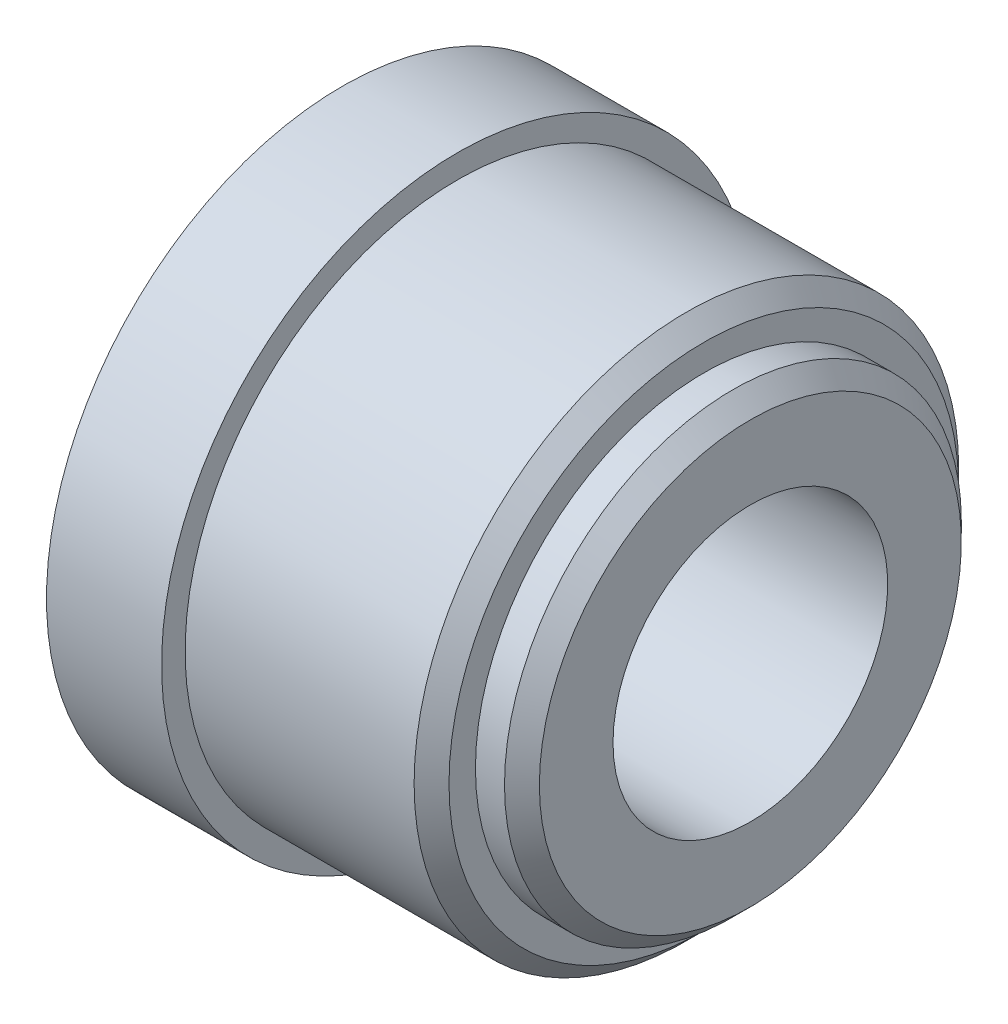
ISO-10303-21;
HEADER;
FILE_DESCRIPTION(('STEP AP214'),'2;1');
FILE_NAME('part.step','',(''),(''),'','','');
FILE_SCHEMA(('AUTOMOTIVE_DESIGN { 1 0 10303 214 1 1 1 1 }'));
ENDSEC;
DATA;
#1=APPLICATION_CONTEXT('core data for automotive mechanical design processes');
#2=APPLICATION_PROTOCOL_DEFINITION('international standard','automotive_design',2000,#1);
#3=PRODUCT_CONTEXT('',#1,'mechanical');
#4=PRODUCT('Part','Part','',(#3));
#5=PRODUCT_RELATED_PRODUCT_CATEGORY('part','',(#4));
#6=PRODUCT_DEFINITION_FORMATION('','',#4);
#7=PRODUCT_DEFINITION_CONTEXT('part definition',#1,'design');
#8=PRODUCT_DEFINITION('design','',#6,#7);
#9=PRODUCT_DEFINITION_SHAPE('','',#8);
#10=(LENGTH_UNIT() NAMED_UNIT(*) SI_UNIT(.MILLI.,.METRE.));
#11=(NAMED_UNIT(*) PLANE_ANGLE_UNIT() SI_UNIT($,.RADIAN.));
#12=(NAMED_UNIT(*) SI_UNIT($,.STERADIAN.) SOLID_ANGLE_UNIT());
#13=UNCERTAINTY_MEASURE_WITH_UNIT(LENGTH_MEASURE(1.E-05),#10,'distance_accuracy_value','');
#14=(GEOMETRIC_REPRESENTATION_CONTEXT(3) GLOBAL_UNCERTAINTY_ASSIGNED_CONTEXT((#13)) GLOBAL_UNIT_ASSIGNED_CONTEXT((#10,
#11,#12)) REPRESENTATION_CONTEXT('',''));
#15=CARTESIAN_POINT('',(0.,0.,0.));
#16=DIRECTION('',(0.,0.,1.));
#17=DIRECTION('',(1.,0.,0.));
#18=AXIS2_PLACEMENT_3D('',#15,#16,#17);
#19=CARTESIAN_POINT('',(9.6774,0.,-5.280025));
#20=DIRECTION('',(1.,0.,0.));
#21=DIRECTION('',(0.,0.,-1.));
#22=AXIS2_PLACEMENT_3D('',#19,#20,#21);
#23=PLANE('',#22);
#24=CARTESIAN_POINT('',(9.6774,0.,0.));
#25=DIRECTION('',(1.,0.,0.));
#26=DIRECTION('',(0.,0.,-1.));
#27=AXIS2_PLACEMENT_3D('',#24,#25,#26);
#28=CIRCLE('',#27,4.9911);
#29=CARTESIAN_POINT('',(9.6774,0.,-4.9911));
#30=VERTEX_POINT('',#29);
#31=EDGE_CURVE('E18',#30,#30,#28,.T.);
#32=ORIENTED_EDGE('',*,*,#31,.F.);
#33=EDGE_LOOP('',(#32));
#34=FACE_BOUND('',#33,.T.);
#35=CARTESIAN_POINT('',(9.67739999998685,0.,0.));
#36=DIRECTION('',(-1.,0.,0.));
#37=DIRECTION('',(0.,0.,1.));
#38=AXIS2_PLACEMENT_3D('',#35,#36,#37);
#39=CIRCLE('',#38,5.56895000011082);
#40=CARTESIAN_POINT('',(9.67739999998685,0.,5.56895000011082));
#41=VERTEX_POINT('',#40);
#42=EDGE_CURVE('E44',#41,#41,#39,.T.);
#43=ORIENTED_EDGE('',*,*,#42,.F.);
#44=EDGE_LOOP('',(#43));
#45=FACE_BOUND('',#44,.T.);
#46=ADVANCED_FACE('F15',(#34,#45),#23,.T.);
#47=CARTESIAN_POINT('',(9.9949,0.,0.));
#48=DIRECTION('',(1.,0.,0.));
#49=DIRECTION('',(0.,0.,-1.));
#50=AXIS2_PLACEMENT_3D('',#47,#48,#49);
#51=CYLINDRICAL_SURFACE('',#50,4.9911);
#52=ORIENTED_EDGE('',*,*,#31,.T.);
#53=EDGE_LOOP('',(#52));
#54=FACE_BOUND('',#53,.T.);
#55=CARTESIAN_POINT('',(10.3124000000321,0.,0.));
#56=DIRECTION('',(-1.,0.,0.));
#57=DIRECTION('',(0.,0.,-1.));
#58=AXIS2_PLACEMENT_3D('',#55,#56,#57);
#59=CIRCLE('',#58,4.99110000004066);
#60=CARTESIAN_POINT('',(10.3124000000321,0.,-4.99110000004066));
#61=VERTEX_POINT('',#60);
#62=EDGE_CURVE('E30',#61,#61,#59,.F.);
#63=ORIENTED_EDGE('',*,*,#62,.F.);
#64=EDGE_LOOP('',(#63));
#65=FACE_BOUND('',#64,.T.);
#66=ADVANCED_FACE('F52',(#54,#65),#51,.T.);
#67=CARTESIAN_POINT('',(9.29640000003928,0.,0.));
#68=DIRECTION('',(-1.,0.,0.));
#69=DIRECTION('',(0.,0.,1.));
#70=AXIS2_PLACEMENT_3D('',#67,#68,#69);
#71=CONICAL_SURFACE('',#70,5.94995000005838,0.785398163397448);
#72=CARTESIAN_POINT('',(9.2964,0.,0.));
#73=DIRECTION('',(1.,0.,0.));
#74=DIRECTION('',(0.,0.,-1.));
#75=AXIS2_PLACEMENT_3D('',#72,#73,#74);
#76=CIRCLE('',#75,5.94995);
#77=CARTESIAN_POINT('',(9.2964,0.,-5.94995));
#78=VERTEX_POINT('',#77);
#79=EDGE_CURVE('E43',#78,#78,#76,.F.);
#80=ORIENTED_EDGE('',*,*,#79,.F.);
#81=EDGE_LOOP('',(#80));
#82=FACE_BOUND('',#81,.T.);
#83=ORIENTED_EDGE('',*,*,#42,.T.);
#84=EDGE_LOOP('',(#83));
#85=FACE_BOUND('',#84,.T.);
#86=ADVANCED_FACE('F61',(#82,#85),#71,.T.);
#87=CARTESIAN_POINT('',(10.3124000000889,0.,0.));
#88=DIRECTION('',(-1.,0.,0.));
#89=DIRECTION('',(0.,0.,1.));
#90=AXIS2_PLACEMENT_3D('',#87,#88,#89);
#91=CONICAL_SURFACE('',#90,4.99109999992697,0.785398163322851);
#92=ORIENTED_EDGE('',*,*,#62,.T.);
#93=EDGE_LOOP('',(#92));
#94=FACE_BOUND('',#93,.T.);
#95=CARTESIAN_POINT('',(10.6934000000365,0.,0.));
#96=DIRECTION('',(-1.,0.,0.));
#97=DIRECTION('',(0.,0.,1.));
#98=AXIS2_PLACEMENT_3D('',#95,#96,#97);
#99=CIRCLE('',#98,4.61010000003625);
#100=CARTESIAN_POINT('',(10.6934000000365,0.,4.61010000003625));
#101=VERTEX_POINT('',#100);
#102=EDGE_CURVE('E41',#101,#101,#99,.F.);
#103=ORIENTED_EDGE('',*,*,#102,.F.);
#104=EDGE_LOOP('',(#103));
#105=FACE_BOUND('',#104,.T.);
#106=ADVANCED_FACE('F88',(#94,#105),#91,.T.);
#107=CARTESIAN_POINT('',(6.7945,0.,0.));
#108=DIRECTION('',(1.,0.,0.));
#109=DIRECTION('',(0.,0.,-1.));
#110=AXIS2_PLACEMENT_3D('',#107,#108,#109);
#111=CYLINDRICAL_SURFACE('',#110,5.94995);
#112=CARTESIAN_POINT('',(4.2926,0.,0.));
#113=DIRECTION('',(1.,0.,0.));
#114=DIRECTION('',(0.,0.,-1.));
#115=AXIS2_PLACEMENT_3D('',#112,#113,#114);
#116=CIRCLE('',#115,5.94995);
#117=CARTESIAN_POINT('',(4.2926,0.,-5.94995));
#118=VERTEX_POINT('',#117);
#119=EDGE_CURVE('E38',#118,#118,#116,.F.);
#120=ORIENTED_EDGE('',*,*,#119,.F.);
#121=EDGE_LOOP('',(#120));
#122=FACE_BOUND('',#121,.T.);
#123=ORIENTED_EDGE('',*,*,#79,.T.);
#124=EDGE_LOOP('',(#123));
#125=FACE_BOUND('',#124,.T.);
#126=ADVANCED_FACE('F84',(#122,#125),#111,.T.);
#127=CARTESIAN_POINT('',(10.6934,0.,-2.30505));
#128=DIRECTION('',(1.,0.,0.));
#129=DIRECTION('',(0.,0.,-1.));
#130=AXIS2_PLACEMENT_3D('',#127,#128,#129);
#131=PLANE('',#130);
#132=ORIENTED_EDGE('',*,*,#102,.T.);
#133=EDGE_LOOP('',(#132));
#134=FACE_BOUND('',#133,.T.);
#135=CARTESIAN_POINT('',(10.6934,0.,0.));
#136=DIRECTION('',(-1.,0.,0.));
#137=DIRECTION('',(0.,0.,1.));
#138=AXIS2_PLACEMENT_3D('',#135,#136,#137);
#139=CIRCLE('',#138,3.00101);
#140=CARTESIAN_POINT('',(10.6934,0.,3.00101));
#141=VERTEX_POINT('',#140);
#142=EDGE_CURVE('E35',#141,#141,#139,.T.);
#143=ORIENTED_EDGE('',*,*,#142,.T.);
#144=EDGE_LOOP('',(#143));
#145=FACE_BOUND('',#144,.T.);
#146=ADVANCED_FACE('F80',(#134,#145),#131,.T.);
#147=CARTESIAN_POINT('',(4.2926,0.,-6.207125));
#148=DIRECTION('',(1.,0.,0.));
#149=DIRECTION('',(0.,0.,-1.));
#150=AXIS2_PLACEMENT_3D('',#147,#148,#149);
#151=PLANE('',#150);
#152=ORIENTED_EDGE('',*,*,#119,.T.);
#153=EDGE_LOOP('',(#152));
#154=FACE_BOUND('',#153,.T.);
#155=CARTESIAN_POINT('',(4.2926,0.,0.));
#156=DIRECTION('',(1.,0.,0.));
#157=DIRECTION('',(0.,0.,-1.));
#158=AXIS2_PLACEMENT_3D('',#155,#156,#157);
#159=CIRCLE('',#158,6.4643);
#160=CARTESIAN_POINT('',(4.2926,0.,-6.4643));
#161=VERTEX_POINT('',#160);
#162=EDGE_CURVE('E27',#161,#161,#159,.F.);
#163=ORIENTED_EDGE('',*,*,#162,.F.);
#164=EDGE_LOOP('',(#163));
#165=FACE_BOUND('',#164,.T.);
#166=ADVANCED_FACE('F76',(#154,#165),#151,.T.);
#167=CARTESIAN_POINT('',(1.778,0.,0.));
#168=DIRECTION('',(-1.,0.,0.));
#169=DIRECTION('',(0.,0.,1.));
#170=AXIS2_PLACEMENT_3D('',#167,#168,#169);
#171=CYLINDRICAL_SURFACE('',#170,3.00101);
#172=CARTESIAN_POINT('',(1.778,0.,0.));
#173=DIRECTION('',(-1.,0.,0.));
#174=DIRECTION('',(0.,0.,1.));
#175=AXIS2_PLACEMENT_3D('',#172,#173,#174);
#176=CIRCLE('',#175,3.00101);
#177=CARTESIAN_POINT('',(1.778,0.,3.00101));
#178=VERTEX_POINT('',#177);
#179=EDGE_CURVE('E22',#178,#178,#176,.F.);
#180=ORIENTED_EDGE('',*,*,#179,.F.);
#181=EDGE_LOOP('',(#180));
#182=FACE_BOUND('',#181,.T.);
#183=ORIENTED_EDGE('',*,*,#142,.F.);
#184=EDGE_LOOP('',(#183));
#185=FACE_BOUND('',#184,.T.);
#186=ADVANCED_FACE('F69',(#182,#185),#171,.F.);
#187=CARTESIAN_POINT('',(3.0353,0.,0.));
#188=DIRECTION('',(1.,0.,0.));
#189=DIRECTION('',(0.,0.,-1.));
#190=AXIS2_PLACEMENT_3D('',#187,#188,#189);
#191=CYLINDRICAL_SURFACE('',#190,6.4643);
#192=CARTESIAN_POINT('',(1.778,0.,0.));
#193=DIRECTION('',(1.,0.,0.));
#194=DIRECTION('',(0.,0.,-1.));
#195=AXIS2_PLACEMENT_3D('',#192,#193,#194);
#196=CIRCLE('',#195,6.4643);
#197=CARTESIAN_POINT('',(1.778,0.,-6.4643));
#198=VERTEX_POINT('',#197);
#199=EDGE_CURVE('E10',#198,#198,#196,.F.);
#200=ORIENTED_EDGE('',*,*,#199,.F.);
#201=EDGE_LOOP('',(#200));
#202=FACE_BOUND('',#201,.T.);
#203=ORIENTED_EDGE('',*,*,#162,.T.);
#204=EDGE_LOOP('',(#203));
#205=FACE_BOUND('',#204,.T.);
#206=ADVANCED_FACE('F64',(#202,#205),#191,.T.);
#207=CARTESIAN_POINT('',(1.778,0.,-3.23215));
#208=DIRECTION('',(-1.,0.,0.));
#209=DIRECTION('',(0.,0.,1.));
#210=AXIS2_PLACEMENT_3D('',#207,#208,#209);
#211=PLANE('',#210);
#212=ORIENTED_EDGE('',*,*,#199,.T.);
#213=EDGE_LOOP('',(#212));
#214=FACE_BOUND('',#213,.T.);
#215=ORIENTED_EDGE('',*,*,#179,.T.);
#216=EDGE_LOOP('',(#215));
#217=FACE_BOUND('',#216,.T.);
#218=ADVANCED_FACE('F62',(#214,#217),#211,.T.);
#219=CLOSED_SHELL('',(#46,#66,#86,#106,#126,#146,#166,#186,#206,#218));
#220=MANIFOLD_SOLID_BREP('B1',#219);
#221=ADVANCED_BREP_SHAPE_REPRESENTATION('',(#18,#220),#14);
#222=SHAPE_DEFINITION_REPRESENTATION(#9,#221);
ENDSEC;
END-ISO-10303-21;
